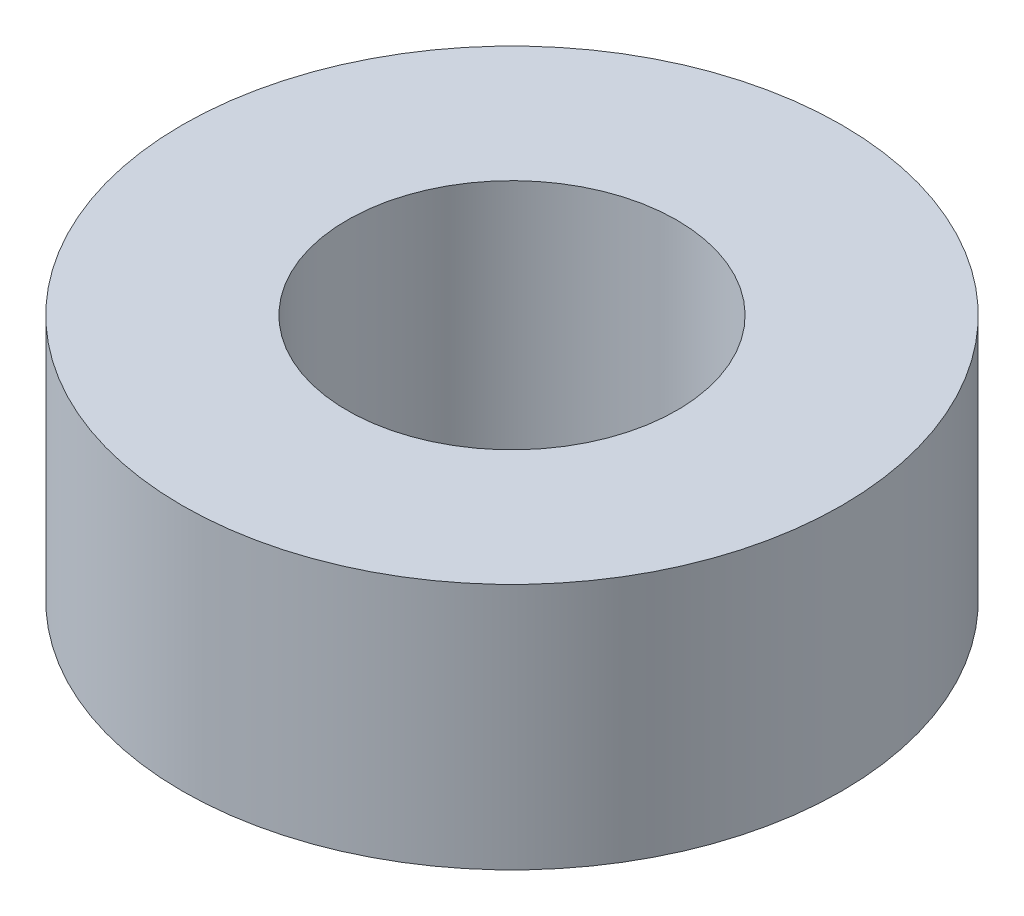
ISO-10303-21;
HEADER;
FILE_DESCRIPTION(('STEP AP214'),'2;1');
FILE_NAME('part.step','',(''),(''),'','','');
FILE_SCHEMA(('AUTOMOTIVE_DESIGN { 1 0 10303 214 1 1 1 1 }'));
ENDSEC;
DATA;
#1=APPLICATION_CONTEXT('core data for automotive mechanical design processes');
#2=APPLICATION_PROTOCOL_DEFINITION('international standard','automotive_design',2000,#1);
#3=PRODUCT_CONTEXT('',#1,'mechanical');
#4=PRODUCT('Part','Part','',(#3));
#5=PRODUCT_RELATED_PRODUCT_CATEGORY('part','',(#4));
#6=PRODUCT_DEFINITION_FORMATION('','',#4);
#7=PRODUCT_DEFINITION_CONTEXT('part definition',#1,'design');
#8=PRODUCT_DEFINITION('design','',#6,#7);
#9=PRODUCT_DEFINITION_SHAPE('','',#8);
#10=(LENGTH_UNIT() NAMED_UNIT(*) SI_UNIT(.MILLI.,.METRE.));
#11=(NAMED_UNIT(*) PLANE_ANGLE_UNIT() SI_UNIT($,.RADIAN.));
#12=(NAMED_UNIT(*) SI_UNIT($,.STERADIAN.) SOLID_ANGLE_UNIT());
#13=UNCERTAINTY_MEASURE_WITH_UNIT(LENGTH_MEASURE(1.E-05),#10,'distance_accuracy_value','');
#14=(GEOMETRIC_REPRESENTATION_CONTEXT(3) GLOBAL_UNCERTAINTY_ASSIGNED_CONTEXT((#13)) GLOBAL_UNIT_ASSIGNED_CONTEXT((#10,
#11,#12)) REPRESENTATION_CONTEXT('',''));
#15=CARTESIAN_POINT('',(0.,0.,0.));
#16=DIRECTION('',(0.,0.,1.));
#17=DIRECTION('',(1.,0.,0.));
#18=AXIS2_PLACEMENT_3D('',#15,#16,#17);
#19=CARTESIAN_POINT('',(0.,0.,0.));
#20=DIRECTION('',(0.,-1.,0.));
#21=DIRECTION('',(0.,0.,-1.));
#22=AXIS2_PLACEMENT_3D('',#19,#20,#21);
#23=CYLINDRICAL_SURFACE('',#22,2.);
#24=CARTESIAN_POINT('',(0.,1.5,0.));
#25=DIRECTION('',(0.,-1.,0.));
#26=DIRECTION('',(0.,0.,-1.));
#27=AXIS2_PLACEMENT_3D('',#24,#25,#26);
#28=CIRCLE('',#27,2.);
#29=CARTESIAN_POINT('',(0.,1.5,-2.));
#30=VERTEX_POINT('',#29);
#31=EDGE_CURVE('E50',#30,#30,#28,.T.);
#32=ORIENTED_EDGE('',*,*,#31,.F.);
#33=EDGE_LOOP('',(#32));
#34=FACE_BOUND('',#33,.T.);
#35=CARTESIAN_POINT('',(0.,-1.5,0.));
#36=DIRECTION('',(0.,-1.,0.));
#37=DIRECTION('',(0.,0.,-1.));
#38=AXIS2_PLACEMENT_3D('',#35,#36,#37);
#39=CIRCLE('',#38,2.);
#40=CARTESIAN_POINT('',(0.,-1.5,-2.));
#41=VERTEX_POINT('',#40);
#42=EDGE_CURVE('E10',#41,#41,#39,.T.);
#43=ORIENTED_EDGE('',*,*,#42,.T.);
#44=EDGE_LOOP('',(#43));
#45=FACE_BOUND('',#44,.T.);
#46=ADVANCED_FACE('F32',(#34,#45),#23,.F.);
#47=CARTESIAN_POINT('',(-4.,-1.5,0.));
#48=DIRECTION('',(0.,1.,0.));
#49=DIRECTION('',(0.,0.,1.));
#50=AXIS2_PLACEMENT_3D('',#47,#48,#49);
#51=PLANE('',#50);
#52=ORIENTED_EDGE('',*,*,#42,.F.);
#53=EDGE_LOOP('',(#52));
#54=FACE_BOUND('',#53,.T.);
#55=CARTESIAN_POINT('',(0.,-1.5,0.));
#56=DIRECTION('',(0.,-1.,0.));
#57=DIRECTION('',(0.,0.,-1.));
#58=AXIS2_PLACEMENT_3D('',#55,#56,#57);
#59=CIRCLE('',#58,4.);
#60=CARTESIAN_POINT('',(0.,-1.5,-4.));
#61=VERTEX_POINT('',#60);
#62=EDGE_CURVE('E39',#61,#61,#59,.T.);
#63=ORIENTED_EDGE('',*,*,#62,.T.);
#64=EDGE_LOOP('',(#63));
#65=FACE_BOUND('',#64,.T.);
#66=ADVANCED_FACE('F59',(#54,#65),#51,.F.);
#67=CARTESIAN_POINT('',(0.,0.,0.));
#68=DIRECTION('',(0.,-1.,0.));
#69=DIRECTION('',(0.,0.,-1.));
#70=AXIS2_PLACEMENT_3D('',#67,#68,#69);
#71=CYLINDRICAL_SURFACE('',#70,4.);
#72=ORIENTED_EDGE('',*,*,#62,.F.);
#73=EDGE_LOOP('',(#72));
#74=FACE_BOUND('',#73,.T.);
#75=CARTESIAN_POINT('',(0.,1.5,0.));
#76=DIRECTION('',(0.,-1.,0.));
#77=DIRECTION('',(0.,0.,-1.));
#78=AXIS2_PLACEMENT_3D('',#75,#76,#77);
#79=CIRCLE('',#78,4.);
#80=CARTESIAN_POINT('',(0.,1.5,-4.));
#81=VERTEX_POINT('',#80);
#82=EDGE_CURVE('E44',#81,#81,#79,.T.);
#83=ORIENTED_EDGE('',*,*,#82,.T.);
#84=EDGE_LOOP('',(#83));
#85=FACE_BOUND('',#84,.T.);
#86=ADVANCED_FACE('F63',(#74,#85),#71,.T.);
#87=CARTESIAN_POINT('',(-4.,1.5,0.));
#88=DIRECTION('',(0.,-1.,0.));
#89=DIRECTION('',(0.,0.,-1.));
#90=AXIS2_PLACEMENT_3D('',#87,#88,#89);
#91=PLANE('',#90);
#92=ORIENTED_EDGE('',*,*,#82,.F.);
#93=EDGE_LOOP('',(#92));
#94=FACE_BOUND('',#93,.T.);
#95=ORIENTED_EDGE('',*,*,#31,.T.);
#96=EDGE_LOOP('',(#95));
#97=FACE_BOUND('',#96,.T.);
#98=ADVANCED_FACE('F56',(#94,#97),#91,.F.);
#99=CLOSED_SHELL('',(#46,#66,#86,#98));
#100=MANIFOLD_SOLID_BREP('B2',#99);
#101=ADVANCED_BREP_SHAPE_REPRESENTATION('',(#18,#100),#14);
#102=SHAPE_DEFINITION_REPRESENTATION(#9,#101);
ENDSEC;
END-ISO-10303-21;
